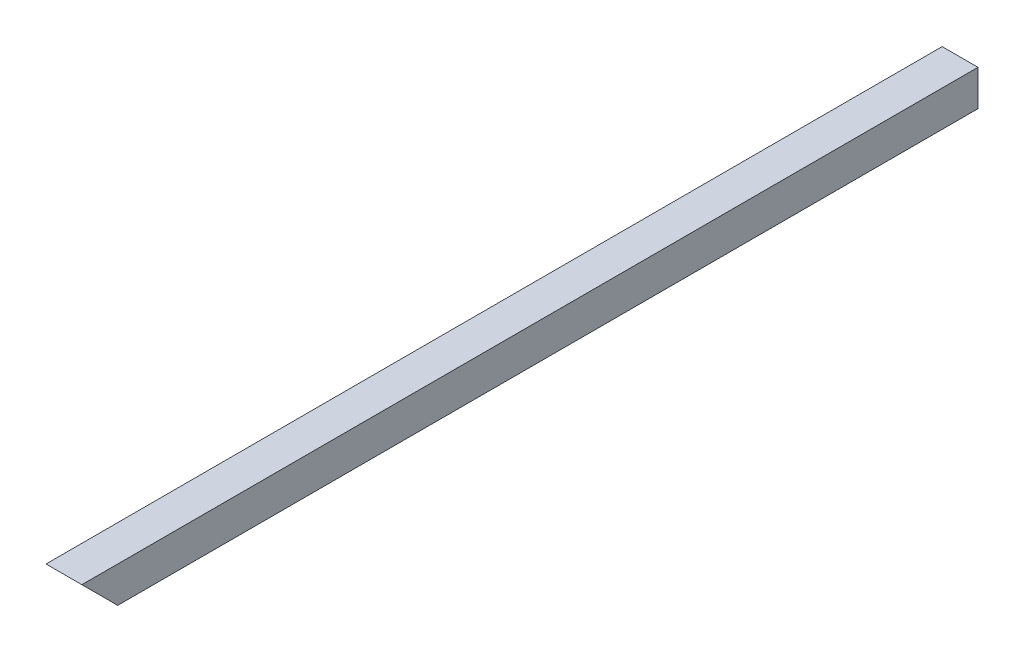
ISO-10303-21;
HEADER;
FILE_DESCRIPTION(('STEP AP214'),'2;1');
FILE_NAME('part.step','',(''),(''),'','','');
FILE_SCHEMA(('AUTOMOTIVE_DESIGN { 1 0 10303 214 1 1 1 1 }'));
ENDSEC;
DATA;
#1=APPLICATION_CONTEXT('core data for automotive mechanical design processes');
#2=APPLICATION_PROTOCOL_DEFINITION('international standard','automotive_design',2000,#1);
#3=PRODUCT_CONTEXT('',#1,'mechanical');
#4=PRODUCT('Part','Part','',(#3));
#5=PRODUCT_RELATED_PRODUCT_CATEGORY('part','',(#4));
#6=PRODUCT_DEFINITION_FORMATION('','',#4);
#7=PRODUCT_DEFINITION_CONTEXT('part definition',#1,'design');
#8=PRODUCT_DEFINITION('design','',#6,#7);
#9=PRODUCT_DEFINITION_SHAPE('','',#8);
#10=(LENGTH_UNIT() NAMED_UNIT(*) SI_UNIT(.MILLI.,.METRE.));
#11=(NAMED_UNIT(*) PLANE_ANGLE_UNIT() SI_UNIT($,.RADIAN.));
#12=(NAMED_UNIT(*) SI_UNIT($,.STERADIAN.) SOLID_ANGLE_UNIT());
#13=UNCERTAINTY_MEASURE_WITH_UNIT(LENGTH_MEASURE(1.E-05),#10,'distance_accuracy_value','');
#14=(GEOMETRIC_REPRESENTATION_CONTEXT(3) GLOBAL_UNCERTAINTY_ASSIGNED_CONTEXT((#13)) GLOBAL_UNIT_ASSIGNED_CONTEXT((#10,
#11,#12)) REPRESENTATION_CONTEXT('',''));
#15=CARTESIAN_POINT('',(0.,0.,0.));
#16=DIRECTION('',(0.,0.,1.));
#17=DIRECTION('',(1.,0.,0.));
#18=AXIS2_PLACEMENT_3D('',#15,#16,#17);
#19=CARTESIAN_POINT('',(0.,0.,0.));
#20=DIRECTION('',(0.,0.,-1.));
#21=DIRECTION('',(-1.,0.,0.));
#22=AXIS2_PLACEMENT_3D('',#19,#20,#21);
#23=PLANE('',#22);
#24=DIRECTION('',(0.,1.,0.));
#25=VECTOR('',#24,1.);
#26=CARTESIAN_POINT('',(25.,-25.,0.));
#27=LINE('',#26,#25);
#28=CARTESIAN_POINT('',(25.,-25.,0.));
#29=VERTEX_POINT('',#28);
#30=CARTESIAN_POINT('',(25.,25.,0.));
#31=VERTEX_POINT('',#30);
#32=EDGE_CURVE('E142',#29,#31,#27,.T.);
#33=ORIENTED_EDGE('',*,*,#32,.F.);
#34=DIRECTION('',(1.,0.,0.));
#35=VECTOR('',#34,1.);
#36=CARTESIAN_POINT('',(-25.,-25.,0.));
#37=LINE('',#36,#35);
#38=CARTESIAN_POINT('',(-25.,-25.,0.));
#39=VERTEX_POINT('',#38);
#40=EDGE_CURVE('E111',#39,#29,#37,.T.);
#41=ORIENTED_EDGE('',*,*,#40,.F.);
#42=DIRECTION('',(0.,-1.,0.));
#43=VECTOR('',#42,1.);
#44=CARTESIAN_POINT('',(-25.,-25.,0.));
#45=LINE('',#44,#43);
#46=CARTESIAN_POINT('',(-25.,25.,0.));
#47=VERTEX_POINT('',#46);
#48=EDGE_CURVE('E137',#47,#39,#45,.T.);
#49=ORIENTED_EDGE('',*,*,#48,.F.);
#50=DIRECTION('',(-1.,0.,0.));
#51=VECTOR('',#50,1.);
#52=CARTESIAN_POINT('',(-25.,25.,0.));
#53=LINE('',#52,#51);
#54=EDGE_CURVE('E125',#31,#47,#53,.T.);
#55=ORIENTED_EDGE('',*,*,#54,.F.);
#56=EDGE_LOOP('',(#33,#41,#49,#55));
#57=FACE_BOUND('',#56,.T.);
#58=DIRECTION('',(1.,0.,0.));
#59=VECTOR('',#58,1.);
#60=CARTESIAN_POINT('',(-23.,-23.,0.));
#61=LINE('',#60,#59);
#62=CARTESIAN_POINT('',(-23.,-23.,0.));
#63=VERTEX_POINT('',#62);
#64=CARTESIAN_POINT('',(23.,-23.,0.));
#65=VERTEX_POINT('',#64);
#66=EDGE_CURVE('E158',#63,#65,#61,.T.);
#67=ORIENTED_EDGE('',*,*,#66,.T.);
#68=DIRECTION('',(0.,1.,0.));
#69=VECTOR('',#68,1.);
#70=CARTESIAN_POINT('',(23.,-23.,0.));
#71=LINE('',#70,#69);
#72=CARTESIAN_POINT('',(23.,23.,0.));
#73=VERTEX_POINT('',#72);
#74=EDGE_CURVE('E170',#65,#73,#71,.T.);
#75=ORIENTED_EDGE('',*,*,#74,.T.);
#76=DIRECTION('',(-1.,0.,0.));
#77=VECTOR('',#76,1.);
#78=CARTESIAN_POINT('',(-23.,23.,0.));
#79=LINE('',#78,#77);
#80=CARTESIAN_POINT('',(-23.,23.,0.));
#81=VERTEX_POINT('',#80);
#82=EDGE_CURVE('E166',#73,#81,#79,.T.);
#83=ORIENTED_EDGE('',*,*,#82,.T.);
#84=DIRECTION('',(0.,-1.,0.));
#85=VECTOR('',#84,1.);
#86=CARTESIAN_POINT('',(-23.,-23.,0.));
#87=LINE('',#86,#85);
#88=EDGE_CURVE('E162',#81,#63,#87,.T.);
#89=ORIENTED_EDGE('',*,*,#88,.T.);
#90=EDGE_LOOP('',(#67,#75,#83,#89));
#91=FACE_BOUND('',#90,.T.);
#92=ADVANCED_FACE('F38',(#57,#91),#23,.T.);
#93=CARTESIAN_POINT('',(25.,-25.,1250.));
#94=DIRECTION('',(-1.,0.,0.));
#95=DIRECTION('',(0.,0.,1.));
#96=AXIS2_PLACEMENT_3D('',#93,#94,#95);
#97=PLANE('',#96);
#98=DIRECTION('',(0.,0.,-1.));
#99=VECTOR('',#98,1.);
#100=CARTESIAN_POINT('',(25.,25.,1250.));
#101=LINE('',#100,#99);
#102=CARTESIAN_POINT('',(25.,25.,1250.));
#103=VERTEX_POINT('',#102);
#104=EDGE_CURVE('E47',#103,#31,#101,.T.);
#105=ORIENTED_EDGE('',*,*,#104,.F.);
#106=DIRECTION('',(0.,0.707106781186547,0.707106781186548));
#107=VECTOR('',#106,1.);
#108=CARTESIAN_POINT('',(25.,-25.,1200.));
#109=LINE('',#108,#107);
#110=CARTESIAN_POINT('',(25.,-25.,1200.));
#111=VERTEX_POINT('',#110);
#112=EDGE_CURVE('E104',#111,#103,#109,.T.);
#113=ORIENTED_EDGE('',*,*,#112,.F.);
#114=DIRECTION('',(0.,0.,-1.));
#115=VECTOR('',#114,1.);
#116=CARTESIAN_POINT('',(25.,-25.,1250.));
#117=LINE('',#116,#115);
#118=EDGE_CURVE('E110',#111,#29,#117,.T.);
#119=ORIENTED_EDGE('',*,*,#118,.T.);
#120=ORIENTED_EDGE('',*,*,#32,.T.);
#121=EDGE_LOOP('',(#105,#113,#119,#120));
#122=FACE_BOUND('',#121,.T.);
#123=ADVANCED_FACE('F40',(#122),#97,.F.);
#124=CARTESIAN_POINT('',(-25.,25.,1250.));
#125=DIRECTION('',(0.,-1.,0.));
#126=DIRECTION('',(1.,0.,0.));
#127=AXIS2_PLACEMENT_3D('',#124,#125,#126);
#128=PLANE('',#127);
#129=ORIENTED_EDGE('',*,*,#54,.T.);
#130=DIRECTION('',(0.,0.,-1.));
#131=VECTOR('',#130,1.);
#132=CARTESIAN_POINT('',(-25.,25.,1250.));
#133=LINE('',#132,#131);
#134=CARTESIAN_POINT('',(-25.,25.,1250.));
#135=VERTEX_POINT('',#134);
#136=EDGE_CURVE('E118',#135,#47,#133,.T.);
#137=ORIENTED_EDGE('',*,*,#136,.F.);
#138=DIRECTION('',(-1.,0.,0.));
#139=VECTOR('',#138,1.);
#140=CARTESIAN_POINT('',(-25.,25.,1250.));
#141=LINE('',#140,#139);
#142=EDGE_CURVE('E101',#103,#135,#141,.T.);
#143=ORIENTED_EDGE('',*,*,#142,.F.);
#144=ORIENTED_EDGE('',*,*,#104,.T.);
#145=EDGE_LOOP('',(#129,#137,#143,#144));
#146=FACE_BOUND('',#145,.T.);
#147=ADVANCED_FACE('F124',(#146),#128,.F.);
#148=CARTESIAN_POINT('',(-25.,-25.,1250.));
#149=DIRECTION('',(1.,0.,0.));
#150=DIRECTION('',(0.,0.,-1.));
#151=AXIS2_PLACEMENT_3D('',#148,#149,#150);
#152=PLANE('',#151);
#153=DIRECTION('',(0.,0.,-1.));
#154=VECTOR('',#153,1.);
#155=CARTESIAN_POINT('',(-25.,-25.,1250.));
#156=LINE('',#155,#154);
#157=CARTESIAN_POINT('',(-25.,-25.,1200.));
#158=VERTEX_POINT('',#157);
#159=EDGE_CURVE('E120',#158,#39,#156,.T.);
#160=ORIENTED_EDGE('',*,*,#159,.F.);
#161=DIRECTION('',(0.,0.707106781186547,0.707106781186548));
#162=VECTOR('',#161,1.);
#163=CARTESIAN_POINT('',(-25.,-25.,1200.));
#164=LINE('',#163,#162);
#165=EDGE_CURVE('E54',#158,#135,#164,.T.);
#166=ORIENTED_EDGE('',*,*,#165,.T.);
#167=ORIENTED_EDGE('',*,*,#136,.T.);
#168=ORIENTED_EDGE('',*,*,#48,.T.);
#169=EDGE_LOOP('',(#160,#166,#167,#168));
#170=FACE_BOUND('',#169,.T.);
#171=ADVANCED_FACE('F116',(#170),#152,.F.);
#172=CARTESIAN_POINT('',(-25.,-25.,1250.));
#173=DIRECTION('',(0.,1.,0.));
#174=DIRECTION('',(0.,0.,1.));
#175=AXIS2_PLACEMENT_3D('',#172,#173,#174);
#176=PLANE('',#175);
#177=ORIENTED_EDGE('',*,*,#118,.F.);
#178=DIRECTION('',(1.,0.,0.));
#179=VECTOR('',#178,1.);
#180=CARTESIAN_POINT('',(-25.,-25.,1200.));
#181=LINE('',#180,#179);
#182=EDGE_CURVE('E122',#158,#111,#181,.T.);
#183=ORIENTED_EDGE('',*,*,#182,.F.);
#184=ORIENTED_EDGE('',*,*,#159,.T.);
#185=ORIENTED_EDGE('',*,*,#40,.T.);
#186=EDGE_LOOP('',(#177,#183,#184,#185));
#187=FACE_BOUND('',#186,.T.);
#188=ADVANCED_FACE('F188',(#187),#176,.F.);
#189=CARTESIAN_POINT('',(23.,-23.,1250.));
#190=DIRECTION('',(-1.,0.,0.));
#191=DIRECTION('',(0.,0.,1.));
#192=AXIS2_PLACEMENT_3D('',#189,#190,#191);
#193=PLANE('',#192);
#194=DIRECTION('',(0.,-0.707106781186547,-0.707106781186548));
#195=VECTOR('',#194,1.);
#196=CARTESIAN_POINT('',(23.,1.00000000000003,1226.));
#197=LINE('',#196,#195);
#198=CARTESIAN_POINT('',(23.,23.,1248.));
#199=VERTEX_POINT('',#198);
#200=CARTESIAN_POINT('',(23.,-23.,1202.));
#201=VERTEX_POINT('',#200);
#202=EDGE_CURVE('E61',#199,#201,#197,.T.);
#203=ORIENTED_EDGE('',*,*,#202,.F.);
#204=DIRECTION('',(0.,0.,-1.));
#205=VECTOR('',#204,1.);
#206=CARTESIAN_POINT('',(23.,23.,1250.));
#207=LINE('',#206,#205);
#208=EDGE_CURVE('E145',#199,#73,#207,.T.);
#209=ORIENTED_EDGE('',*,*,#208,.T.);
#210=ORIENTED_EDGE('',*,*,#74,.F.);
#211=DIRECTION('',(0.,0.,-1.));
#212=VECTOR('',#211,1.);
#213=CARTESIAN_POINT('',(23.,-23.,1250.));
#214=LINE('',#213,#212);
#215=EDGE_CURVE('E155',#201,#65,#214,.T.);
#216=ORIENTED_EDGE('',*,*,#215,.F.);
#217=EDGE_LOOP('',(#203,#209,#210,#216));
#218=FACE_BOUND('',#217,.T.);
#219=ADVANCED_FACE('F203',(#218),#193,.T.);
#220=CARTESIAN_POINT('',(-23.,23.,1250.));
#221=DIRECTION('',(0.,-1.,0.));
#222=DIRECTION('',(0.,0.,-1.));
#223=AXIS2_PLACEMENT_3D('',#220,#221,#222);
#224=PLANE('',#223);
#225=DIRECTION('',(1.,0.,0.));
#226=VECTOR('',#225,1.);
#227=CARTESIAN_POINT('',(-23.,23.,1248.));
#228=LINE('',#227,#226);
#229=CARTESIAN_POINT('',(-23.,23.,1248.));
#230=VERTEX_POINT('',#229);
#231=EDGE_CURVE('E176',#230,#199,#228,.T.);
#232=ORIENTED_EDGE('',*,*,#231,.F.);
#233=DIRECTION('',(0.,0.,-1.));
#234=VECTOR('',#233,1.);
#235=CARTESIAN_POINT('',(-23.,23.,1250.));
#236=LINE('',#235,#234);
#237=EDGE_CURVE('E149',#230,#81,#236,.T.);
#238=ORIENTED_EDGE('',*,*,#237,.T.);
#239=ORIENTED_EDGE('',*,*,#82,.F.);
#240=ORIENTED_EDGE('',*,*,#208,.F.);
#241=EDGE_LOOP('',(#232,#238,#239,#240));
#242=FACE_BOUND('',#241,.T.);
#243=ADVANCED_FACE('F208',(#242),#224,.T.);
#244=CARTESIAN_POINT('',(-23.,-23.,1250.));
#245=DIRECTION('',(1.,0.,0.));
#246=DIRECTION('',(0.,0.,-1.));
#247=AXIS2_PLACEMENT_3D('',#244,#245,#246);
#248=PLANE('',#247);
#249=DIRECTION('',(0.,0.707106781186547,0.707106781186548));
#250=VECTOR('',#249,1.);
#251=CARTESIAN_POINT('',(-23.,1.00000000000003,1226.));
#252=LINE('',#251,#250);
#253=CARTESIAN_POINT('',(-23.,-23.,1202.));
#254=VERTEX_POINT('',#253);
#255=EDGE_CURVE('E179',#254,#230,#252,.T.);
#256=ORIENTED_EDGE('',*,*,#255,.F.);
#257=DIRECTION('',(0.,0.,-1.));
#258=VECTOR('',#257,1.);
#259=CARTESIAN_POINT('',(-23.,-23.,1250.));
#260=LINE('',#259,#258);
#261=EDGE_CURVE('E152',#254,#63,#260,.T.);
#262=ORIENTED_EDGE('',*,*,#261,.T.);
#263=ORIENTED_EDGE('',*,*,#88,.F.);
#264=ORIENTED_EDGE('',*,*,#237,.F.);
#265=EDGE_LOOP('',(#256,#262,#263,#264));
#266=FACE_BOUND('',#265,.T.);
#267=ADVANCED_FACE('F212',(#266),#248,.T.);
#268=CARTESIAN_POINT('',(-23.,-23.,1250.));
#269=DIRECTION('',(0.,1.,0.));
#270=DIRECTION('',(0.,0.,1.));
#271=AXIS2_PLACEMENT_3D('',#268,#269,#270);
#272=PLANE('',#271);
#273=DIRECTION('',(-1.,0.,0.));
#274=VECTOR('',#273,1.);
#275=CARTESIAN_POINT('',(-23.,-23.,1202.));
#276=LINE('',#275,#274);
#277=EDGE_CURVE('E11',#201,#254,#276,.T.);
#278=ORIENTED_EDGE('',*,*,#277,.F.);
#279=ORIENTED_EDGE('',*,*,#215,.T.);
#280=ORIENTED_EDGE('',*,*,#66,.F.);
#281=ORIENTED_EDGE('',*,*,#261,.F.);
#282=EDGE_LOOP('',(#278,#279,#280,#281));
#283=FACE_BOUND('',#282,.T.);
#284=ADVANCED_FACE('F200',(#283),#272,.T.);
#285=CARTESIAN_POINT('',(-25.,-25.,1200.));
#286=DIRECTION('',(0.,0.707106781186548,-0.707106781186547));
#287=DIRECTION('',(0.,0.707106781186547,0.707106781186548));
#288=AXIS2_PLACEMENT_3D('',#285,#286,#287);
#289=PLANE('',#288);
#290=ORIENTED_EDGE('',*,*,#202,.T.);
#291=ORIENTED_EDGE('',*,*,#277,.T.);
#292=ORIENTED_EDGE('',*,*,#255,.T.);
#293=ORIENTED_EDGE('',*,*,#231,.T.);
#294=EDGE_LOOP('',(#290,#291,#292,#293));
#295=FACE_BOUND('',#294,.T.);
#296=ORIENTED_EDGE('',*,*,#112,.T.);
#297=ORIENTED_EDGE('',*,*,#142,.T.);
#298=ORIENTED_EDGE('',*,*,#165,.F.);
#299=ORIENTED_EDGE('',*,*,#182,.T.);
#300=EDGE_LOOP('',(#296,#297,#298,#299));
#301=FACE_BOUND('',#300,.T.);
#302=ADVANCED_FACE('F102',(#295,#301),#289,.F.);
#303=CLOSED_SHELL('',(#92,#123,#147,#171,#188,#219,#243,#267,#284,#302));
#304=MANIFOLD_SOLID_BREP('B2',#303);
#305=ADVANCED_BREP_SHAPE_REPRESENTATION('',(#18,#304),#14);
#306=SHAPE_DEFINITION_REPRESENTATION(#9,#305);
ENDSEC;
END-ISO-10303-21;
